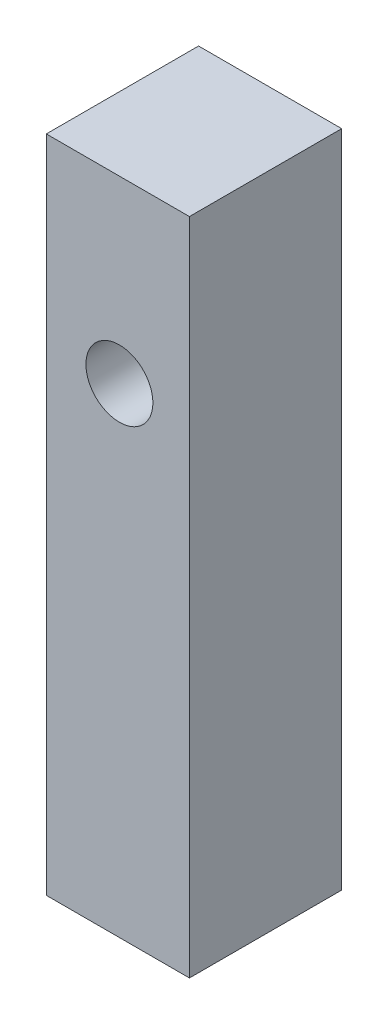
ISO-10303-21;
HEADER;
FILE_DESCRIPTION(('STEP AP214'),'2;1');
FILE_NAME('part.step','',(''),(''),'','','');
FILE_SCHEMA(('AUTOMOTIVE_DESIGN { 1 0 10303 214 1 1 1 1 }'));
ENDSEC;
DATA;
#1=APPLICATION_CONTEXT('core data for automotive mechanical design processes');
#2=APPLICATION_PROTOCOL_DEFINITION('international standard','automotive_design',2000,#1);
#3=PRODUCT_CONTEXT('',#1,'mechanical');
#4=PRODUCT('Part','Part','',(#3));
#5=PRODUCT_RELATED_PRODUCT_CATEGORY('part','',(#4));
#6=PRODUCT_DEFINITION_FORMATION('','',#4);
#7=PRODUCT_DEFINITION_CONTEXT('part definition',#1,'design');
#8=PRODUCT_DEFINITION('design','',#6,#7);
#9=PRODUCT_DEFINITION_SHAPE('','',#8);
#10=(LENGTH_UNIT() NAMED_UNIT(*) SI_UNIT(.MILLI.,.METRE.));
#11=(NAMED_UNIT(*) PLANE_ANGLE_UNIT() SI_UNIT($,.RADIAN.));
#12=(NAMED_UNIT(*) SI_UNIT($,.STERADIAN.) SOLID_ANGLE_UNIT());
#13=UNCERTAINTY_MEASURE_WITH_UNIT(LENGTH_MEASURE(1.E-05),#10,'distance_accuracy_value','');
#14=(GEOMETRIC_REPRESENTATION_CONTEXT(3) GLOBAL_UNCERTAINTY_ASSIGNED_CONTEXT((#13)) GLOBAL_UNIT_ASSIGNED_CONTEXT((#10,
#11,#12)) REPRESENTATION_CONTEXT('',''));
#15=CARTESIAN_POINT('',(0.,0.,0.));
#16=DIRECTION('',(0.,0.,1.));
#17=DIRECTION('',(1.,0.,0.));
#18=AXIS2_PLACEMENT_3D('',#15,#16,#17);
#19=CARTESIAN_POINT('',(0.,0.,5.));
#20=DIRECTION('',(0.,0.,1.));
#21=DIRECTION('',(1.,0.,0.));
#22=AXIS2_PLACEMENT_3D('',#19,#20,#21);
#23=PLANE('',#22);
#24=DIRECTION('',(0.,1.,0.));
#25=VECTOR('',#24,1.);
#26=CARTESIAN_POINT('',(15.95,-15.7550000000809,5.));
#27=LINE('',#26,#25);
#28=CARTESIAN_POINT('',(15.95,-15.7550000000809,5.));
#29=VERTEX_POINT('',#28);
#30=CARTESIAN_POINT('',(15.95,5.9,5.));
#31=VERTEX_POINT('',#30);
#32=EDGE_CURVE('E81',#29,#31,#27,.T.);
#33=ORIENTED_EDGE('',*,*,#32,.T.);
#34=DIRECTION('',(-1.,0.,0.));
#35=VECTOR('',#34,1.);
#36=CARTESIAN_POINT('',(15.95,5.9,5.));
#37=LINE('',#36,#35);
#38=CARTESIAN_POINT('',(11.25,5.9,5.));
#39=VERTEX_POINT('',#38);
#40=EDGE_CURVE('E84',#31,#39,#37,.T.);
#41=ORIENTED_EDGE('',*,*,#40,.T.);
#42=DIRECTION('',(0.,-1.,0.));
#43=VECTOR('',#42,1.);
#44=CARTESIAN_POINT('',(11.25,5.9,5.));
#45=LINE('',#44,#43);
#46=CARTESIAN_POINT('',(11.25,-15.7550000000809,5.));
#47=VERTEX_POINT('',#46);
#48=EDGE_CURVE('E88',#39,#47,#45,.T.);
#49=ORIENTED_EDGE('',*,*,#48,.T.);
#50=DIRECTION('',(1.,0.,0.));
#51=VECTOR('',#50,1.);
#52=CARTESIAN_POINT('',(11.25,-15.7550000000809,5.));
#53=LINE('',#52,#51);
#54=EDGE_CURVE('E52',#47,#29,#53,.T.);
#55=ORIENTED_EDGE('',*,*,#54,.T.);
#56=EDGE_LOOP('',(#33,#41,#49,#55));
#57=FACE_BOUND('',#56,.T.);
#58=CARTESIAN_POINT('',(13.65,0.,5.));
#59=DIRECTION('',(0.,0.,1.));
#60=DIRECTION('',(1.,0.,0.));
#61=AXIS2_PLACEMENT_3D('',#58,#59,#60);
#62=CIRCLE('',#61,1.1);
#63=CARTESIAN_POINT('',(14.75,0.,5.));
#64=VERTEX_POINT('',#63);
#65=EDGE_CURVE('E101',#64,#64,#62,.T.);
#66=ORIENTED_EDGE('',*,*,#65,.F.);
#67=EDGE_LOOP('',(#66));
#68=FACE_BOUND('',#67,.T.);
#69=ADVANCED_FACE('F35',(#57,#68),#23,.T.);
#70=CARTESIAN_POINT('',(0.,0.,0.));
#71=DIRECTION('',(0.,0.,1.));
#72=DIRECTION('',(1.,0.,0.));
#73=AXIS2_PLACEMENT_3D('',#70,#71,#72);
#74=PLANE('',#73);
#75=DIRECTION('',(0.,1.,0.));
#76=VECTOR('',#75,1.);
#77=CARTESIAN_POINT('',(15.95,0.65,0.));
#78=LINE('',#77,#76);
#79=CARTESIAN_POINT('',(15.95,-15.7550000000809,0.));
#80=VERTEX_POINT('',#79);
#81=CARTESIAN_POINT('',(15.95,5.9,0.));
#82=VERTEX_POINT('',#81);
#83=EDGE_CURVE('E76',#80,#82,#78,.T.);
#84=ORIENTED_EDGE('',*,*,#83,.F.);
#85=DIRECTION('',(1.,0.,0.));
#86=VECTOR('',#85,1.);
#87=CARTESIAN_POINT('',(11.25,-15.7550000000809,0.));
#88=LINE('',#87,#86);
#89=CARTESIAN_POINT('',(11.25,-15.7550000000809,0.));
#90=VERTEX_POINT('',#89);
#91=EDGE_CURVE('E104',#90,#80,#88,.T.);
#92=ORIENTED_EDGE('',*,*,#91,.F.);
#93=DIRECTION('',(0.,-1.,0.));
#94=VECTOR('',#93,1.);
#95=CARTESIAN_POINT('',(11.25,5.9,0.));
#96=LINE('',#95,#94);
#97=CARTESIAN_POINT('',(11.25,5.9,0.));
#98=VERTEX_POINT('',#97);
#99=EDGE_CURVE('E69',#98,#90,#96,.T.);
#100=ORIENTED_EDGE('',*,*,#99,.F.);
#101=DIRECTION('',(-1.,0.,0.));
#102=VECTOR('',#101,1.);
#103=CARTESIAN_POINT('',(15.95,5.9,0.));
#104=LINE('',#103,#102);
#105=EDGE_CURVE('E92',#82,#98,#104,.T.);
#106=ORIENTED_EDGE('',*,*,#105,.F.);
#107=EDGE_LOOP('',(#84,#92,#100,#106));
#108=FACE_BOUND('',#107,.T.);
#109=CARTESIAN_POINT('',(13.65,0.,0.));
#110=DIRECTION('',(0.,0.,1.));
#111=DIRECTION('',(1.,0.,0.));
#112=AXIS2_PLACEMENT_3D('',#109,#110,#111);
#113=CIRCLE('',#112,1.1);
#114=CARTESIAN_POINT('',(14.75,0.,0.));
#115=VERTEX_POINT('',#114);
#116=EDGE_CURVE('E116',#115,#115,#113,.T.);
#117=ORIENTED_EDGE('',*,*,#116,.T.);
#118=EDGE_LOOP('',(#117));
#119=FACE_BOUND('',#118,.T.);
#120=ADVANCED_FACE('F110',(#108,#119),#74,.F.);
#121=CARTESIAN_POINT('',(15.95,0.65,5.));
#122=DIRECTION('',(-1.,0.,0.));
#123=DIRECTION('',(0.,0.,1.));
#124=AXIS2_PLACEMENT_3D('',#121,#122,#123);
#125=PLANE('',#124);
#126=ORIENTED_EDGE('',*,*,#83,.T.);
#127=DIRECTION('',(0.,0.,-1.));
#128=VECTOR('',#127,1.);
#129=CARTESIAN_POINT('',(15.95,5.9,5.));
#130=LINE('',#129,#128);
#131=EDGE_CURVE('E11',#31,#82,#130,.T.);
#132=ORIENTED_EDGE('',*,*,#131,.F.);
#133=ORIENTED_EDGE('',*,*,#32,.F.);
#134=DIRECTION('',(0.,0.,-1.));
#135=VECTOR('',#134,1.);
#136=CARTESIAN_POINT('',(15.95,-15.7550000000809,5.));
#137=LINE('',#136,#135);
#138=EDGE_CURVE('E96',#29,#80,#137,.T.);
#139=ORIENTED_EDGE('',*,*,#138,.T.);
#140=EDGE_LOOP('',(#126,#132,#133,#139));
#141=FACE_BOUND('',#140,.T.);
#142=ADVANCED_FACE('F37',(#141),#125,.F.);
#143=CARTESIAN_POINT('',(15.95,5.9,5.));
#144=DIRECTION('',(0.,-1.,0.));
#145=DIRECTION('',(0.,0.,-1.));
#146=AXIS2_PLACEMENT_3D('',#143,#144,#145);
#147=PLANE('',#146);
#148=ORIENTED_EDGE('',*,*,#105,.T.);
#149=DIRECTION('',(0.,0.,-1.));
#150=VECTOR('',#149,1.);
#151=CARTESIAN_POINT('',(11.25,5.9,5.));
#152=LINE('',#151,#150);
#153=EDGE_CURVE('E44',#39,#98,#152,.T.);
#154=ORIENTED_EDGE('',*,*,#153,.F.);
#155=ORIENTED_EDGE('',*,*,#40,.F.);
#156=ORIENTED_EDGE('',*,*,#131,.T.);
#157=EDGE_LOOP('',(#148,#154,#155,#156));
#158=FACE_BOUND('',#157,.T.);
#159=ADVANCED_FACE('F91',(#158),#147,.F.);
#160=CARTESIAN_POINT('',(11.25,5.9,5.));
#161=DIRECTION('',(1.,0.,0.));
#162=DIRECTION('',(0.,0.,-1.));
#163=AXIS2_PLACEMENT_3D('',#160,#161,#162);
#164=PLANE('',#163);
#165=ORIENTED_EDGE('',*,*,#99,.T.);
#166=DIRECTION('',(0.,0.,-1.));
#167=VECTOR('',#166,1.);
#168=CARTESIAN_POINT('',(11.25,-15.7550000000809,5.));
#169=LINE('',#168,#167);
#170=EDGE_CURVE('E93',#47,#90,#169,.T.);
#171=ORIENTED_EDGE('',*,*,#170,.F.);
#172=ORIENTED_EDGE('',*,*,#48,.F.);
#173=ORIENTED_EDGE('',*,*,#153,.T.);
#174=EDGE_LOOP('',(#165,#171,#172,#173));
#175=FACE_BOUND('',#174,.T.);
#176=ADVANCED_FACE('F94',(#175),#164,.F.);
#177=CARTESIAN_POINT('',(11.25,-15.7550000000809,5.));
#178=DIRECTION('',(0.,1.,0.));
#179=DIRECTION('',(-1.,0.,0.));
#180=AXIS2_PLACEMENT_3D('',#177,#178,#179);
#181=PLANE('',#180);
#182=ORIENTED_EDGE('',*,*,#91,.T.);
#183=ORIENTED_EDGE('',*,*,#138,.F.);
#184=ORIENTED_EDGE('',*,*,#54,.F.);
#185=ORIENTED_EDGE('',*,*,#170,.T.);
#186=EDGE_LOOP('',(#182,#183,#184,#185));
#187=FACE_BOUND('',#186,.T.);
#188=ADVANCED_FACE('F109',(#187),#181,.F.);
#189=CARTESIAN_POINT('',(13.65,0.,5.));
#190=DIRECTION('',(0.,0.,-1.));
#191=DIRECTION('',(-1.,0.,0.));
#192=AXIS2_PLACEMENT_3D('',#189,#190,#191);
#193=CYLINDRICAL_SURFACE('',#192,1.1);
#194=ORIENTED_EDGE('',*,*,#65,.T.);
#195=EDGE_LOOP('',(#194));
#196=FACE_BOUND('',#195,.T.);
#197=ORIENTED_EDGE('',*,*,#116,.F.);
#198=EDGE_LOOP('',(#197));
#199=FACE_BOUND('',#198,.T.);
#200=ADVANCED_FACE('F123',(#196,#199),#193,.F.);
#201=CLOSED_SHELL('',(#69,#120,#142,#159,#176,#188,#200));
#202=MANIFOLD_SOLID_BREP('B2',#201);
#203=ADVANCED_BREP_SHAPE_REPRESENTATION('',(#18,#202),#14);
#204=SHAPE_DEFINITION_REPRESENTATION(#9,#203);
ENDSEC;
END-ISO-10303-21;
